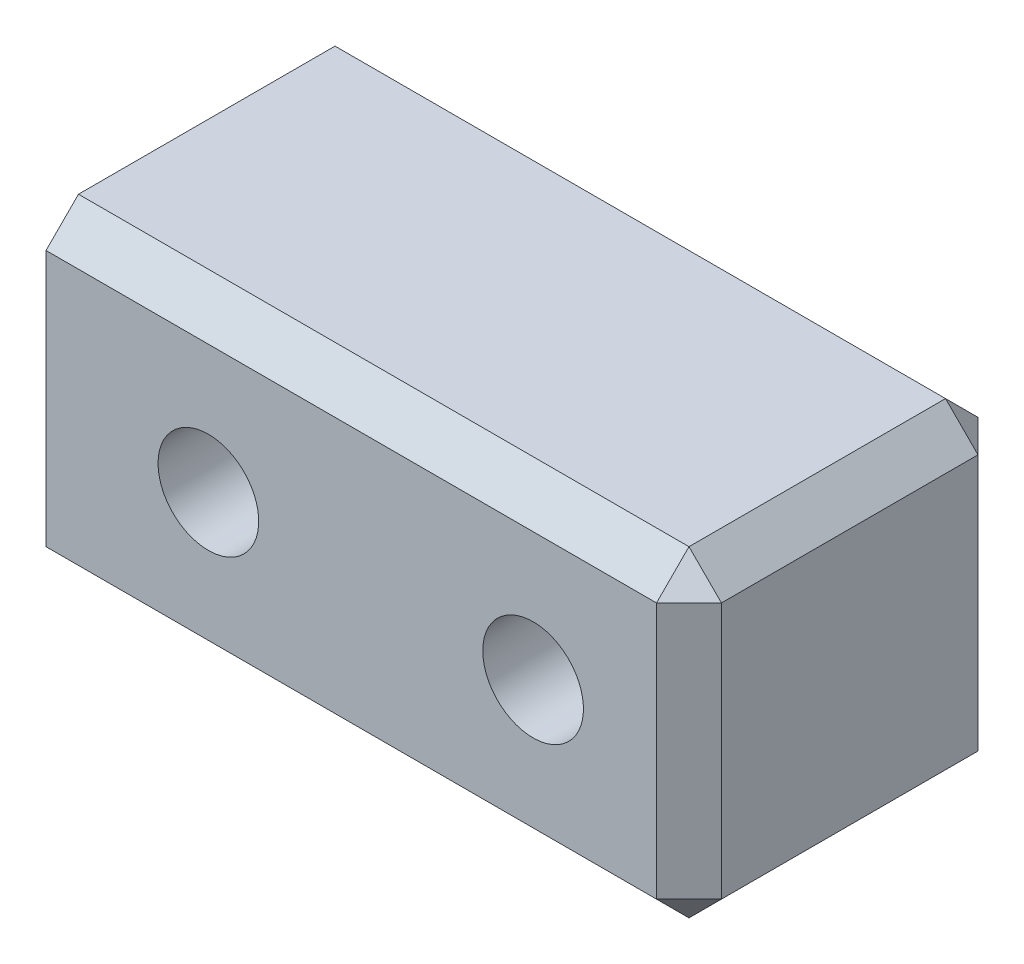
ISO-10303-21;
HEADER;
FILE_DESCRIPTION(('STEP AP214'),'2;1');
FILE_NAME('part.step','',(''),(''),'','','');
FILE_SCHEMA(('AUTOMOTIVE_DESIGN { 1 0 10303 214 1 1 1 1 }'));
ENDSEC;
DATA;
#1=APPLICATION_CONTEXT('core data for automotive mechanical design processes');
#2=APPLICATION_PROTOCOL_DEFINITION('international standard','automotive_design',2000,#1);
#3=PRODUCT_CONTEXT('',#1,'mechanical');
#4=PRODUCT('Part','Part','',(#3));
#5=PRODUCT_RELATED_PRODUCT_CATEGORY('part','',(#4));
#6=PRODUCT_DEFINITION_FORMATION('','',#4);
#7=PRODUCT_DEFINITION_CONTEXT('part definition',#1,'design');
#8=PRODUCT_DEFINITION('design','',#6,#7);
#9=PRODUCT_DEFINITION_SHAPE('','',#8);
#10=(LENGTH_UNIT() NAMED_UNIT(*) SI_UNIT(.MILLI.,.METRE.));
#11=(NAMED_UNIT(*) PLANE_ANGLE_UNIT() SI_UNIT($,.RADIAN.));
#12=(NAMED_UNIT(*) SI_UNIT($,.STERADIAN.) SOLID_ANGLE_UNIT());
#13=UNCERTAINTY_MEASURE_WITH_UNIT(LENGTH_MEASURE(1.E-05),#10,'distance_accuracy_value','');
#14=(GEOMETRIC_REPRESENTATION_CONTEXT(3) GLOBAL_UNCERTAINTY_ASSIGNED_CONTEXT((#13)) GLOBAL_UNIT_ASSIGNED_CONTEXT((#10,
#11,#12)) REPRESENTATION_CONTEXT('',''));
#15=CARTESIAN_POINT('',(0.,0.,0.));
#16=DIRECTION('',(0.,0.,1.));
#17=DIRECTION('',(1.,0.,0.));
#18=AXIS2_PLACEMENT_3D('',#15,#16,#17);
#19=CARTESIAN_POINT('',(0.,0.,-9.9));
#20=DIRECTION('',(0.,0.,1.));
#21=DIRECTION('',(-1.,0.,0.));
#22=AXIS2_PLACEMENT_3D('',#19,#20,#21);
#23=PLANE('',#22);
#24=DIRECTION('',(0.,-1.,0.));
#25=VECTOR('',#24,1.);
#26=CARTESIAN_POINT('',(0.,0.,-9.9));
#27=LINE('',#26,#25);
#28=CARTESIAN_POINT('',(0.,8.9,-9.9));
#29=VERTEX_POINT('',#28);
#30=CARTESIAN_POINT('',(0.,1.,-9.9));
#31=VERTEX_POINT('',#30);
#32=EDGE_CURVE('E230',#29,#31,#27,.T.);
#33=ORIENTED_EDGE('',*,*,#32,.F.);
#34=DIRECTION('',(-1.,0.,0.));
#35=VECTOR('',#34,1.);
#36=CARTESIAN_POINT('',(0.,8.9,-9.9));
#37=LINE('',#36,#35);
#38=CARTESIAN_POINT('',(18.8,8.9,-9.9));
#39=VERTEX_POINT('',#38);
#40=EDGE_CURVE('E170',#39,#29,#37,.T.);
#41=ORIENTED_EDGE('',*,*,#40,.F.);
#42=DIRECTION('',(0.,1.,0.));
#43=VECTOR('',#42,1.);
#44=CARTESIAN_POINT('',(18.8,0.,-9.9));
#45=LINE('',#44,#43);
#46=CARTESIAN_POINT('',(18.8,1.,-9.9));
#47=VERTEX_POINT('',#46);
#48=EDGE_CURVE('E173',#47,#39,#45,.T.);
#49=ORIENTED_EDGE('',*,*,#48,.F.);
#50=DIRECTION('',(1.,0.,0.));
#51=VECTOR('',#50,1.);
#52=CARTESIAN_POINT('',(0.,1.,-9.9));
#53=LINE('',#52,#51);
#54=EDGE_CURVE('E176',#31,#47,#53,.T.);
#55=ORIENTED_EDGE('',*,*,#54,.F.);
#56=EDGE_LOOP('',(#33,#41,#49,#55));
#57=FACE_BOUND('',#56,.T.);
#58=CARTESIAN_POINT('',(5.,4.95,-9.9));
#59=DIRECTION('',(0.,0.,1.));
#60=DIRECTION('',(1.,0.,0.));
#61=AXIS2_PLACEMENT_3D('',#58,#59,#60);
#62=CIRCLE('',#61,1.55);
#63=CARTESIAN_POINT('',(3.45,4.95,-9.9));
#64=VERTEX_POINT('',#63);
#65=EDGE_CURVE('E224',#64,#64,#62,.T.);
#66=ORIENTED_EDGE('',*,*,#65,.T.);
#67=EDGE_LOOP('',(#66));
#68=FACE_BOUND('',#67,.T.);
#69=CARTESIAN_POINT('',(15.,4.95,-9.9));
#70=DIRECTION('',(0.,0.,1.));
#71=DIRECTION('',(1.,0.,0.));
#72=AXIS2_PLACEMENT_3D('',#69,#70,#71);
#73=CIRCLE('',#72,1.55);
#74=CARTESIAN_POINT('',(13.45,4.95,-9.9));
#75=VERTEX_POINT('',#74);
#76=EDGE_CURVE('E216',#75,#75,#73,.T.);
#77=ORIENTED_EDGE('',*,*,#76,.T.);
#78=EDGE_LOOP('',(#77));
#79=FACE_BOUND('',#78,.T.);
#80=ADVANCED_FACE('F43',(#57,#68,#79),#23,.F.);
#81=CARTESIAN_POINT('',(0.,0.,0.));
#82=DIRECTION('',(0.,0.,1.));
#83=DIRECTION('',(-1.,0.,0.));
#84=AXIS2_PLACEMENT_3D('',#81,#82,#83);
#85=PLANE('',#84);
#86=CARTESIAN_POINT('',(5.,4.95,0.));
#87=DIRECTION('',(0.,0.,1.));
#88=DIRECTION('',(1.,0.,0.));
#89=AXIS2_PLACEMENT_3D('',#86,#87,#88);
#90=CIRCLE('',#89,1.55);
#91=CARTESIAN_POINT('',(3.45,4.95,0.));
#92=VERTEX_POINT('',#91);
#93=EDGE_CURVE('E221',#92,#92,#90,.T.);
#94=ORIENTED_EDGE('',*,*,#93,.F.);
#95=EDGE_LOOP('',(#94));
#96=FACE_BOUND('',#95,.T.);
#97=DIRECTION('',(0.,-1.,0.));
#98=VECTOR('',#97,1.);
#99=CARTESIAN_POINT('',(18.8,0.,0.));
#100=LINE('',#99,#98);
#101=CARTESIAN_POINT('',(18.8,8.9,0.));
#102=VERTEX_POINT('',#101);
#103=CARTESIAN_POINT('',(18.8,1.,0.));
#104=VERTEX_POINT('',#103);
#105=EDGE_CURVE('E191',#102,#104,#100,.T.);
#106=ORIENTED_EDGE('',*,*,#105,.F.);
#107=DIRECTION('',(1.,0.,0.));
#108=VECTOR('',#107,1.);
#109=CARTESIAN_POINT('',(19.8,8.9,0.));
#110=LINE('',#109,#108);
#111=CARTESIAN_POINT('',(0.,8.9,0.));
#112=VERTEX_POINT('',#111);
#113=EDGE_CURVE('E189',#112,#102,#110,.T.);
#114=ORIENTED_EDGE('',*,*,#113,.F.);
#115=DIRECTION('',(0.,-1.,0.));
#116=VECTOR('',#115,1.);
#117=CARTESIAN_POINT('',(0.,0.,0.));
#118=LINE('',#117,#116);
#119=CARTESIAN_POINT('',(0.,1.,0.));
#120=VERTEX_POINT('',#119);
#121=EDGE_CURVE('E227',#112,#120,#118,.T.);
#122=ORIENTED_EDGE('',*,*,#121,.T.);
#123=DIRECTION('',(-1.,0.,0.));
#124=VECTOR('',#123,1.);
#125=CARTESIAN_POINT('',(0.,1.,0.));
#126=LINE('',#125,#124);
#127=EDGE_CURVE('E193',#104,#120,#126,.T.);
#128=ORIENTED_EDGE('',*,*,#127,.F.);
#129=EDGE_LOOP('',(#106,#114,#122,#128));
#130=FACE_BOUND('',#129,.T.);
#131=CARTESIAN_POINT('',(15.,4.95,0.));
#132=DIRECTION('',(0.,0.,1.));
#133=DIRECTION('',(1.,0.,0.));
#134=AXIS2_PLACEMENT_3D('',#131,#132,#133);
#135=CIRCLE('',#134,1.55);
#136=CARTESIAN_POINT('',(13.45,4.95,0.));
#137=VERTEX_POINT('',#136);
#138=EDGE_CURVE('E213',#137,#137,#135,.T.);
#139=ORIENTED_EDGE('',*,*,#138,.F.);
#140=EDGE_LOOP('',(#139));
#141=FACE_BOUND('',#140,.T.);
#142=ADVANCED_FACE('F247',(#96,#130,#141),#85,.T.);
#143=CARTESIAN_POINT('',(0.,0.,-9.9));
#144=DIRECTION('',(1.,0.,0.));
#145=DIRECTION('',(0.,0.,1.));
#146=AXIS2_PLACEMENT_3D('',#143,#144,#145);
#147=PLANE('',#146);
#148=DIRECTION('',(0.,0.,1.));
#149=VECTOR('',#148,1.);
#150=CARTESIAN_POINT('',(0.,0.,-9.9));
#151=LINE('',#150,#149);
#152=CARTESIAN_POINT('',(0.,0.,-8.9));
#153=VERTEX_POINT('',#152);
#154=CARTESIAN_POINT('',(0.,0.,-1.));
#155=VERTEX_POINT('',#154);
#156=EDGE_CURVE('E152',#153,#155,#151,.T.);
#157=ORIENTED_EDGE('',*,*,#156,.T.);
#158=DIRECTION('',(0.,-0.707106781186549,-0.707106781186546));
#159=VECTOR('',#158,1.);
#160=CARTESIAN_POINT('',(0.,0.,-1.));
#161=LINE('',#160,#159);
#162=EDGE_CURVE('E184',#120,#155,#161,.T.);
#163=ORIENTED_EDGE('',*,*,#162,.F.);
#164=ORIENTED_EDGE('',*,*,#121,.F.);
#165=DIRECTION('',(0.,-0.707106781186546,0.707106781186549));
#166=VECTOR('',#165,1.);
#167=CARTESIAN_POINT('',(0.,9.9,-1.));
#168=LINE('',#167,#166);
#169=CARTESIAN_POINT('',(0.,9.9,-1.00000000000001));
#170=VERTEX_POINT('',#169);
#171=EDGE_CURVE('E182',#170,#112,#168,.T.);
#172=ORIENTED_EDGE('',*,*,#171,.F.);
#173=DIRECTION('',(0.,0.,1.));
#174=VECTOR('',#173,1.);
#175=CARTESIAN_POINT('',(0.,9.9,-9.9));
#176=LINE('',#175,#174);
#177=CARTESIAN_POINT('',(0.,9.9,-8.9));
#178=VERTEX_POINT('',#177);
#179=EDGE_CURVE('E155',#178,#170,#176,.T.);
#180=ORIENTED_EDGE('',*,*,#179,.F.);
#181=DIRECTION('',(0.,-0.707106781186546,-0.707106781186549));
#182=VECTOR('',#181,1.);
#183=CARTESIAN_POINT('',(0.,8.9,-9.9));
#184=LINE('',#183,#182);
#185=EDGE_CURVE('E179',#29,#178,#184,.F.);
#186=ORIENTED_EDGE('',*,*,#185,.F.);
#187=ORIENTED_EDGE('',*,*,#32,.T.);
#188=DIRECTION('',(0.,-0.707106781186546,0.707106781186549));
#189=VECTOR('',#188,1.);
#190=CARTESIAN_POINT('',(0.,1.,-9.9));
#191=LINE('',#190,#189);
#192=EDGE_CURVE('E187',#153,#31,#191,.F.);
#193=ORIENTED_EDGE('',*,*,#192,.F.);
#194=EDGE_LOOP('',(#157,#163,#164,#172,#180,#186,#187,#193));
#195=FACE_BOUND('',#194,.T.);
#196=ADVANCED_FACE('F241',(#195),#147,.F.);
#197=CARTESIAN_POINT('',(0.,0.,-9.9));
#198=DIRECTION('',(0.,1.,0.));
#199=DIRECTION('',(0.,0.,-1.));
#200=AXIS2_PLACEMENT_3D('',#197,#198,#199);
#201=PLANE('',#200);
#202=DIRECTION('',(0.,0.,-1.));
#203=VECTOR('',#202,1.);
#204=CARTESIAN_POINT('',(18.8,0.,-9.9));
#205=LINE('',#204,#203);
#206=CARTESIAN_POINT('',(18.8,0.,-1.));
#207=VERTEX_POINT('',#206);
#208=CARTESIAN_POINT('',(18.8,0.,-8.9));
#209=VERTEX_POINT('',#208);
#210=EDGE_CURVE('E165',#207,#209,#205,.T.);
#211=ORIENTED_EDGE('',*,*,#210,.F.);
#212=DIRECTION('',(1.,0.,0.));
#213=VECTOR('',#212,1.);
#214=CARTESIAN_POINT('',(19.8,0.,-1.));
#215=LINE('',#214,#213);
#216=EDGE_CURVE('E162',#155,#207,#215,.T.);
#217=ORIENTED_EDGE('',*,*,#216,.F.);
#218=ORIENTED_EDGE('',*,*,#156,.F.);
#219=DIRECTION('',(-1.,0.,0.));
#220=VECTOR('',#219,1.);
#221=CARTESIAN_POINT('',(0.,0.,-8.9));
#222=LINE('',#221,#220);
#223=EDGE_CURVE('E168',#209,#153,#222,.T.);
#224=ORIENTED_EDGE('',*,*,#223,.F.);
#225=EDGE_LOOP('',(#211,#217,#218,#224));
#226=FACE_BOUND('',#225,.T.);
#227=ADVANCED_FACE('F275',(#226),#201,.F.);
#228=CARTESIAN_POINT('',(19.8,0.,-9.9));
#229=DIRECTION('',(-1.,0.,0.));
#230=DIRECTION('',(0.,0.,-1.));
#231=AXIS2_PLACEMENT_3D('',#228,#229,#230);
#232=PLANE('',#231);
#233=DIRECTION('',(0.,-1.,0.));
#234=VECTOR('',#233,1.);
#235=CARTESIAN_POINT('',(19.8,0.,-8.9));
#236=LINE('',#235,#234);
#237=CARTESIAN_POINT('',(19.8,8.9,-8.9));
#238=VERTEX_POINT('',#237);
#239=CARTESIAN_POINT('',(19.8,1.,-8.9));
#240=VERTEX_POINT('',#239);
#241=EDGE_CURVE('E148',#238,#240,#236,.T.);
#242=ORIENTED_EDGE('',*,*,#241,.F.);
#243=DIRECTION('',(0.,0.,-1.));
#244=VECTOR('',#243,1.);
#245=CARTESIAN_POINT('',(19.8,8.9,-9.9));
#246=LINE('',#245,#244);
#247=CARTESIAN_POINT('',(19.8,8.9,-1.));
#248=VERTEX_POINT('',#247);
#249=EDGE_CURVE('E135',#248,#238,#246,.T.);
#250=ORIENTED_EDGE('',*,*,#249,.F.);
#251=DIRECTION('',(0.,1.,0.));
#252=VECTOR('',#251,1.);
#253=CARTESIAN_POINT('',(19.8,9.9,-1.));
#254=LINE('',#253,#252);
#255=CARTESIAN_POINT('',(19.8,1.,-1.));
#256=VERTEX_POINT('',#255);
#257=EDGE_CURVE('E141',#256,#248,#254,.T.);
#258=ORIENTED_EDGE('',*,*,#257,.F.);
#259=DIRECTION('',(0.,0.,1.));
#260=VECTOR('',#259,1.);
#261=CARTESIAN_POINT('',(19.8,1.,-9.9));
#262=LINE('',#261,#260);
#263=EDGE_CURVE('E160',#240,#256,#262,.T.);
#264=ORIENTED_EDGE('',*,*,#263,.F.);
#265=EDGE_LOOP('',(#242,#250,#258,#264));
#266=FACE_BOUND('',#265,.T.);
#267=ADVANCED_FACE('F150',(#266),#232,.F.);
#268=CARTESIAN_POINT('',(0.,9.9,-9.9));
#269=DIRECTION('',(0.,-1.,0.));
#270=DIRECTION('',(0.,0.,1.));
#271=AXIS2_PLACEMENT_3D('',#268,#269,#270);
#272=PLANE('',#271);
#273=DIRECTION('',(0.,0.,1.));
#274=VECTOR('',#273,1.);
#275=CARTESIAN_POINT('',(18.8,9.9,-9.9));
#276=LINE('',#275,#274);
#277=CARTESIAN_POINT('',(18.8,9.9,-8.9));
#278=VERTEX_POINT('',#277);
#279=CARTESIAN_POINT('',(18.8,9.9,-1.));
#280=VERTEX_POINT('',#279);
#281=EDGE_CURVE('E52',#278,#280,#276,.T.);
#282=ORIENTED_EDGE('',*,*,#281,.F.);
#283=DIRECTION('',(1.,0.,0.));
#284=VECTOR('',#283,1.);
#285=CARTESIAN_POINT('',(0.,9.9,-8.9));
#286=LINE('',#285,#284);
#287=EDGE_CURVE('E196',#178,#278,#286,.T.);
#288=ORIENTED_EDGE('',*,*,#287,.F.);
#289=ORIENTED_EDGE('',*,*,#179,.T.);
#290=DIRECTION('',(-1.,0.,0.));
#291=VECTOR('',#290,1.);
#292=CARTESIAN_POINT('',(0.,9.9,-1.));
#293=LINE('',#292,#291);
#294=EDGE_CURVE('E11',#280,#170,#293,.T.);
#295=ORIENTED_EDGE('',*,*,#294,.F.);
#296=EDGE_LOOP('',(#282,#288,#289,#295));
#297=FACE_BOUND('',#296,.T.);
#298=ADVANCED_FACE('F238',(#297),#272,.F.);
#299=CARTESIAN_POINT('',(5.,4.95,-9.9));
#300=DIRECTION('',(0.,0.,1.));
#301=DIRECTION('',(-1.,0.,0.));
#302=AXIS2_PLACEMENT_3D('',#299,#300,#301);
#303=CYLINDRICAL_SURFACE('',#302,1.55);
#304=CARTESIAN_POINT('',(3.45,4.95,-9.9));
#305=CARTESIAN_POINT('',(3.45,4.95,-9.796875));
#306=CARTESIAN_POINT('',(3.45,4.95,-9.69375));
#307=CARTESIAN_POINT('',(3.45,4.95,-9.4875));
#308=CARTESIAN_POINT('',(3.45,4.95,-9.384375));
#309=CARTESIAN_POINT('',(3.45,4.95,-9.178125));
#310=CARTESIAN_POINT('',(3.45,4.95,-9.075));
#311=CARTESIAN_POINT('',(3.45,4.95,-8.86875));
#312=CARTESIAN_POINT('',(3.45,4.95,-8.765625));
#313=CARTESIAN_POINT('',(3.45,4.95,-8.559375));
#314=CARTESIAN_POINT('',(3.45,4.95,-8.45625));
#315=CARTESIAN_POINT('',(3.45,4.95,-8.25));
#316=CARTESIAN_POINT('',(3.45,4.95,-8.146875));
#317=CARTESIAN_POINT('',(3.45,4.95,-7.940625));
#318=CARTESIAN_POINT('',(3.45,4.95,-7.8375));
#319=CARTESIAN_POINT('',(3.45,4.95,-7.63125));
#320=CARTESIAN_POINT('',(3.45,4.95,-7.528125));
#321=CARTESIAN_POINT('',(3.45,4.95,-7.321875));
#322=CARTESIAN_POINT('',(3.45,4.95,-7.21875));
#323=CARTESIAN_POINT('',(3.45,4.95,-7.0125));
#324=CARTESIAN_POINT('',(3.45,4.95,-6.909375));
#325=CARTESIAN_POINT('',(3.45,4.95,-6.703125));
#326=CARTESIAN_POINT('',(3.45,4.95,-6.6));
#327=CARTESIAN_POINT('',(3.45,4.95,-6.39375));
#328=CARTESIAN_POINT('',(3.45,4.95,-6.290625));
#329=CARTESIAN_POINT('',(3.45,4.95,-6.084375));
#330=CARTESIAN_POINT('',(3.45,4.95,-5.98125));
#331=CARTESIAN_POINT('',(3.45,4.95,-5.775));
#332=CARTESIAN_POINT('',(3.45,4.95,-5.671875));
#333=CARTESIAN_POINT('',(3.45,4.95,-5.465625));
#334=CARTESIAN_POINT('',(3.45,4.95,-5.3625));
#335=CARTESIAN_POINT('',(3.45,4.95,-5.15625));
#336=CARTESIAN_POINT('',(3.45,4.95,-5.053125));
#337=CARTESIAN_POINT('',(3.45,4.95,-4.846875));
#338=CARTESIAN_POINT('',(3.45,4.95,-4.74375));
#339=CARTESIAN_POINT('',(3.45,4.95,-4.5375));
#340=CARTESIAN_POINT('',(3.45,4.95,-4.434375));
#341=CARTESIAN_POINT('',(3.45,4.95,-4.228125));
#342=CARTESIAN_POINT('',(3.45,4.95,-4.125));
#343=CARTESIAN_POINT('',(3.45,4.95,-3.91875));
#344=CARTESIAN_POINT('',(3.45,4.95,-3.815625));
#345=CARTESIAN_POINT('',(3.45,4.95,-3.609375));
#346=CARTESIAN_POINT('',(3.45,4.95,-3.50625));
#347=CARTESIAN_POINT('',(3.45,4.95,-3.3));
#348=CARTESIAN_POINT('',(3.45,4.95,-3.196875));
#349=CARTESIAN_POINT('',(3.45,4.95,-2.990625));
#350=CARTESIAN_POINT('',(3.45,4.95,-2.8875));
#351=CARTESIAN_POINT('',(3.45,4.95,-2.68125));
#352=CARTESIAN_POINT('',(3.45,4.95,-2.578125));
#353=CARTESIAN_POINT('',(3.45,4.95,-2.371875));
#354=CARTESIAN_POINT('',(3.45,4.95,-2.26875));
#355=CARTESIAN_POINT('',(3.45,4.95,-2.0625));
#356=CARTESIAN_POINT('',(3.45,4.95,-1.959375));
#357=CARTESIAN_POINT('',(3.45,4.95,-1.753125));
#358=CARTESIAN_POINT('',(3.45,4.95,-1.65));
#359=CARTESIAN_POINT('',(3.45,4.95,-1.44375));
#360=CARTESIAN_POINT('',(3.45,4.95,-1.340625));
#361=CARTESIAN_POINT('',(3.45,4.95,-1.134375));
#362=CARTESIAN_POINT('',(3.45,4.95,-1.03125));
#363=CARTESIAN_POINT('',(3.45,4.95,-0.825));
#364=CARTESIAN_POINT('',(3.45,4.95,-0.721875));
#365=CARTESIAN_POINT('',(3.45,4.95,-0.515625));
#366=CARTESIAN_POINT('',(3.45,4.95,-0.4125));
#367=CARTESIAN_POINT('',(3.45,4.95,-0.20625));
#368=CARTESIAN_POINT('',(3.45,4.95,-0.103125));
#369=CARTESIAN_POINT('',(3.45,4.95,0.));
#370=B_SPLINE_CURVE_WITH_KNOTS('',3,(#304,#305,#306,#307,#308,#309,#310,#311,#312,#313,#314,
#315,#316,#317,#318,#319,#320,#321,#322,#323,#324,#325,#326,#327,#328,#329,#330,#331,#332,#333,
#334,#335,#336,#337,#338,#339,#340,#341,#342,#343,#344,#345,#346,#347,#348,#349,#350,#351,#352,
#353,#354,#355,#356,#357,#358,#359,#360,#361,#362,#363,#364,#365,#366,#367,#368,#369),
.UNSPECIFIED.,.F.,.F.,(4,2,2,2,2,2,2,2,2,2,2,2,2,2,2,2,2,2,2,2,2,2,2,2,2,2,2,2,2,2,2,2,4),(0.,
0.309375000000001,0.618750000000001,0.928125000000002,1.2375,1.546875,1.85625,2.165625,2.475,
2.784375,3.09375,3.403125,3.7125,4.021875,4.33125,4.640625,4.95,5.259375,5.56875,5.878125,
6.1875,6.496875,6.80625,7.115625,7.425,7.734375,8.04375,8.353125,8.6625,8.971875,9.28125,
9.590625,9.9),.UNSPECIFIED.);
#371=EDGE_CURVE('BSEAM292',#64,#92,#370,.T.);
#372=ORIENTED_EDGE('',*,*,#65,.F.);
#373=ORIENTED_EDGE('',*,*,#93,.T.);
#374=ORIENTED_EDGE('',*,*,#371,.T.);
#375=ORIENTED_EDGE('',*,*,#371,.F.);
#376=EDGE_LOOP('',(#372,#374,#373,#375));
#377=FACE_BOUND('',#376,.T.);
#378=ADVANCED_FACE('F292',(#377),#303,.F.);
#379=CARTESIAN_POINT('',(15.,4.95,-9.9));
#380=DIRECTION('',(0.,0.,1.));
#381=DIRECTION('',(-1.,0.,0.));
#382=AXIS2_PLACEMENT_3D('',#379,#380,#381);
#383=CYLINDRICAL_SURFACE('',#382,1.55);
#384=CARTESIAN_POINT('',(13.45,4.95,-9.9));
#385=CARTESIAN_POINT('',(13.45,4.95,-9.796875));
#386=CARTESIAN_POINT('',(13.45,4.95,-9.69375));
#387=CARTESIAN_POINT('',(13.45,4.95,-9.4875));
#388=CARTESIAN_POINT('',(13.45,4.95,-9.384375));
#389=CARTESIAN_POINT('',(13.45,4.95,-9.178125));
#390=CARTESIAN_POINT('',(13.45,4.95,-9.075));
#391=CARTESIAN_POINT('',(13.45,4.95,-8.86875));
#392=CARTESIAN_POINT('',(13.45,4.95,-8.765625));
#393=CARTESIAN_POINT('',(13.45,4.95,-8.559375));
#394=CARTESIAN_POINT('',(13.45,4.95,-8.45625));
#395=CARTESIAN_POINT('',(13.45,4.95,-8.25));
#396=CARTESIAN_POINT('',(13.45,4.95,-8.146875));
#397=CARTESIAN_POINT('',(13.45,4.95,-7.940625));
#398=CARTESIAN_POINT('',(13.45,4.95,-7.8375));
#399=CARTESIAN_POINT('',(13.45,4.95,-7.63125));
#400=CARTESIAN_POINT('',(13.45,4.95,-7.528125));
#401=CARTESIAN_POINT('',(13.45,4.95,-7.321875));
#402=CARTESIAN_POINT('',(13.45,4.95,-7.21875));
#403=CARTESIAN_POINT('',(13.45,4.95,-7.0125));
#404=CARTESIAN_POINT('',(13.45,4.95,-6.909375));
#405=CARTESIAN_POINT('',(13.45,4.95,-6.703125));
#406=CARTESIAN_POINT('',(13.45,4.95,-6.6));
#407=CARTESIAN_POINT('',(13.45,4.95,-6.39375));
#408=CARTESIAN_POINT('',(13.45,4.95,-6.290625));
#409=CARTESIAN_POINT('',(13.45,4.95,-6.084375));
#410=CARTESIAN_POINT('',(13.45,4.95,-5.98125));
#411=CARTESIAN_POINT('',(13.45,4.95,-5.775));
#412=CARTESIAN_POINT('',(13.45,4.95,-5.671875));
#413=CARTESIAN_POINT('',(13.45,4.95,-5.465625));
#414=CARTESIAN_POINT('',(13.45,4.95,-5.3625));
#415=CARTESIAN_POINT('',(13.45,4.95,-5.15625));
#416=CARTESIAN_POINT('',(13.45,4.95,-5.053125));
#417=CARTESIAN_POINT('',(13.45,4.95,-4.846875));
#418=CARTESIAN_POINT('',(13.45,4.95,-4.74375));
#419=CARTESIAN_POINT('',(13.45,4.95,-4.5375));
#420=CARTESIAN_POINT('',(13.45,4.95,-4.434375));
#421=CARTESIAN_POINT('',(13.45,4.95,-4.228125));
#422=CARTESIAN_POINT('',(13.45,4.95,-4.125));
#423=CARTESIAN_POINT('',(13.45,4.95,-3.91875));
#424=CARTESIAN_POINT('',(13.45,4.95,-3.815625));
#425=CARTESIAN_POINT('',(13.45,4.95,-3.609375));
#426=CARTESIAN_POINT('',(13.45,4.95,-3.50625));
#427=CARTESIAN_POINT('',(13.45,4.95,-3.3));
#428=CARTESIAN_POINT('',(13.45,4.95,-3.196875));
#429=CARTESIAN_POINT('',(13.45,4.95,-2.990625));
#430=CARTESIAN_POINT('',(13.45,4.95,-2.8875));
#431=CARTESIAN_POINT('',(13.45,4.95,-2.68125));
#432=CARTESIAN_POINT('',(13.45,4.95,-2.578125));
#433=CARTESIAN_POINT('',(13.45,4.95,-2.371875));
#434=CARTESIAN_POINT('',(13.45,4.95,-2.26875));
#435=CARTESIAN_POINT('',(13.45,4.95,-2.0625));
#436=CARTESIAN_POINT('',(13.45,4.95,-1.959375));
#437=CARTESIAN_POINT('',(13.45,4.95,-1.753125));
#438=CARTESIAN_POINT('',(13.45,4.95,-1.65));
#439=CARTESIAN_POINT('',(13.45,4.95,-1.44375));
#440=CARTESIAN_POINT('',(13.45,4.95,-1.340625));
#441=CARTESIAN_POINT('',(13.45,4.95,-1.134375));
#442=CARTESIAN_POINT('',(13.45,4.95,-1.03125));
#443=CARTESIAN_POINT('',(13.45,4.95,-0.825));
#444=CARTESIAN_POINT('',(13.45,4.95,-0.721875));
#445=CARTESIAN_POINT('',(13.45,4.95,-0.515625));
#446=CARTESIAN_POINT('',(13.45,4.95,-0.4125));
#447=CARTESIAN_POINT('',(13.45,4.95,-0.20625));
#448=CARTESIAN_POINT('',(13.45,4.95,-0.103125));
#449=CARTESIAN_POINT('',(13.45,4.95,0.));
#450=B_SPLINE_CURVE_WITH_KNOTS('',3,(#384,#385,#386,#387,#388,#389,#390,#391,#392,#393,#394,
#395,#396,#397,#398,#399,#400,#401,#402,#403,#404,#405,#406,#407,#408,#409,#410,#411,#412,#413,
#414,#415,#416,#417,#418,#419,#420,#421,#422,#423,#424,#425,#426,#427,#428,#429,#430,#431,#432,
#433,#434,#435,#436,#437,#438,#439,#440,#441,#442,#443,#444,#445,#446,#447,#448,#449),
.UNSPECIFIED.,.F.,.F.,(4,2,2,2,2,2,2,2,2,2,2,2,2,2,2,2,2,2,2,2,2,2,2,2,2,2,2,2,2,2,2,2,4),(0.,
0.309375000000001,0.618750000000001,0.928125000000002,1.2375,1.546875,1.85625,2.165625,2.475,
2.784375,3.09375,3.403125,3.7125,4.021875,4.33125,4.640625,4.95,5.259375,5.56875,5.878125,
6.1875,6.496875,6.80625,7.115625,7.425,7.734375,8.04375,8.353125,8.6625,8.971875,9.28125,
9.590625,9.9),.UNSPECIFIED.);
#451=EDGE_CURVE('BSEAM299',#75,#137,#450,.T.);
#452=ORIENTED_EDGE('',*,*,#76,.F.);
#453=ORIENTED_EDGE('',*,*,#138,.T.);
#454=ORIENTED_EDGE('',*,*,#451,.T.);
#455=ORIENTED_EDGE('',*,*,#451,.F.);
#456=EDGE_LOOP('',(#452,#454,#453,#455));
#457=FACE_BOUND('',#456,.T.);
#458=ADVANCED_FACE('F299',(#457),#383,.F.);
#459=CARTESIAN_POINT('',(0.,8.9,-9.9));
#460=DIRECTION('',(0.,-0.707106781186549,0.707106781186546));
#461=DIRECTION('',(-1.,0.,0.));
#462=AXIS2_PLACEMENT_3D('',#459,#460,#461);
#463=PLANE('',#462);
#464=ORIENTED_EDGE('',*,*,#185,.T.);
#465=ORIENTED_EDGE('',*,*,#287,.T.);
#466=DIRECTION('',(0.,0.707106781186546,0.707106781186549));
#467=VECTOR('',#466,1.);
#468=CARTESIAN_POINT('',(18.8,8.9,-9.9));
#469=LINE('',#468,#467);
#470=EDGE_CURVE('E47',#278,#39,#469,.F.);
#471=ORIENTED_EDGE('',*,*,#470,.T.);
#472=ORIENTED_EDGE('',*,*,#40,.T.);
#473=EDGE_LOOP('',(#464,#465,#471,#472));
#474=FACE_BOUND('',#473,.T.);
#475=ADVANCED_FACE('F45',(#474),#463,.F.);
#476=CARTESIAN_POINT('',(18.8,9.9,-9.9));
#477=DIRECTION('',(-0.707106781186546,-0.707106781186549,0.));
#478=DIRECTION('',(0.,0.,1.));
#479=AXIS2_PLACEMENT_3D('',#476,#477,#478);
#480=PLANE('',#479);
#481=DIRECTION('',(-0.707106781186549,0.707106781186546,0.));
#482=VECTOR('',#481,1.);
#483=CARTESIAN_POINT('',(19.8,8.9,-1.));
#484=LINE('',#483,#482);
#485=EDGE_CURVE('E125',#280,#248,#484,.F.);
#486=ORIENTED_EDGE('',*,*,#485,.T.);
#487=ORIENTED_EDGE('',*,*,#249,.T.);
#488=DIRECTION('',(0.707106781186549,-0.707106781186546,0.));
#489=VECTOR('',#488,1.);
#490=CARTESIAN_POINT('',(19.3,9.4,-8.9));
#491=LINE('',#490,#489);
#492=EDGE_CURVE('E67',#238,#278,#491,.F.);
#493=ORIENTED_EDGE('',*,*,#492,.T.);
#494=ORIENTED_EDGE('',*,*,#281,.T.);
#495=EDGE_LOOP('',(#486,#487,#493,#494));
#496=FACE_BOUND('',#495,.T.);
#497=ADVANCED_FACE('F133',(#496),#480,.F.);
#498=CARTESIAN_POINT('',(0.,9.9,-1.));
#499=DIRECTION('',(0.,0.707106781186549,0.707106781186546));
#500=DIRECTION('',(1.,0.,0.));
#501=AXIS2_PLACEMENT_3D('',#498,#499,#500);
#502=PLANE('',#501);
#503=ORIENTED_EDGE('',*,*,#171,.T.);
#504=ORIENTED_EDGE('',*,*,#113,.T.);
#505=DIRECTION('',(0.,0.707106781186546,-0.707106781186549));
#506=VECTOR('',#505,1.);
#507=CARTESIAN_POINT('',(18.8,9.4,-0.500000000000002));
#508=LINE('',#507,#506);
#509=EDGE_CURVE('E59',#102,#280,#508,.T.);
#510=ORIENTED_EDGE('',*,*,#509,.T.);
#511=ORIENTED_EDGE('',*,*,#294,.T.);
#512=EDGE_LOOP('',(#503,#504,#510,#511));
#513=FACE_BOUND('',#512,.T.);
#514=ADVANCED_FACE('F243',(#513),#502,.T.);
#515=CARTESIAN_POINT('',(18.8,8.9,-9.9));
#516=DIRECTION('',(0.577350269189626,0.577350269189628,-0.577350269189624));
#517=DIRECTION('',(-0.707106781186549,0.707106781186546,0.));
#518=AXIS2_PLACEMENT_3D('',#515,#516,#517);
#519=PLANE('',#518);
#520=ORIENTED_EDGE('',*,*,#492,.F.);
#521=DIRECTION('',(-0.707106781186546,0.,-0.707106781186549));
#522=VECTOR('',#521,1.);
#523=CARTESIAN_POINT('',(18.8,8.9,-9.9));
#524=LINE('',#523,#522);
#525=EDGE_CURVE('E130',#238,#39,#524,.T.);
#526=ORIENTED_EDGE('',*,*,#525,.T.);
#527=ORIENTED_EDGE('',*,*,#470,.F.);
#528=EDGE_LOOP('',(#520,#526,#527));
#529=FACE_BOUND('',#528,.T.);
#530=ADVANCED_FACE('F264',(#529),#519,.T.);
#531=CARTESIAN_POINT('',(19.8,8.9,-1.));
#532=DIRECTION('',(0.577350269189624,0.577350269189628,0.577350269189626));
#533=DIRECTION('',(0.,0.707106781186546,-0.707106781186549));
#534=AXIS2_PLACEMENT_3D('',#531,#532,#533);
#535=PLANE('',#534);
#536=ORIENTED_EDGE('',*,*,#509,.F.);
#537=DIRECTION('',(-0.707106781186549,0.,0.707106781186546));
#538=VECTOR('',#537,1.);
#539=CARTESIAN_POINT('',(19.8,8.9,-1.));
#540=LINE('',#539,#538);
#541=EDGE_CURVE('E122',#102,#248,#540,.F.);
#542=ORIENTED_EDGE('',*,*,#541,.T.);
#543=ORIENTED_EDGE('',*,*,#485,.F.);
#544=EDGE_LOOP('',(#536,#542,#543));
#545=FACE_BOUND('',#544,.T.);
#546=ADVANCED_FACE('F124',(#545),#535,.T.);
#547=CARTESIAN_POINT('',(0.,1.,-9.9));
#548=DIRECTION('',(0.,0.707106781186549,0.707106781186546));
#549=DIRECTION('',(1.,0.,0.));
#550=AXIS2_PLACEMENT_3D('',#547,#548,#549);
#551=PLANE('',#550);
#552=ORIENTED_EDGE('',*,*,#192,.T.);
#553=ORIENTED_EDGE('',*,*,#54,.T.);
#554=DIRECTION('',(0.,0.707106781186546,-0.707106781186549));
#555=VECTOR('',#554,1.);
#556=CARTESIAN_POINT('',(18.8,0.,-8.9));
#557=LINE('',#556,#555);
#558=EDGE_CURVE('E131',#47,#209,#557,.F.);
#559=ORIENTED_EDGE('',*,*,#558,.T.);
#560=ORIENTED_EDGE('',*,*,#223,.T.);
#561=EDGE_LOOP('',(#552,#553,#559,#560));
#562=FACE_BOUND('',#561,.T.);
#563=ADVANCED_FACE('F272',(#562),#551,.F.);
#564=CARTESIAN_POINT('',(18.8,0.,-9.9));
#565=DIRECTION('',(-0.707106781186549,0.,0.707106781186546));
#566=DIRECTION('',(0.,1.,0.));
#567=AXIS2_PLACEMENT_3D('',#564,#565,#566);
#568=PLANE('',#567);
#569=ORIENTED_EDGE('',*,*,#525,.F.);
#570=ORIENTED_EDGE('',*,*,#241,.T.);
#571=DIRECTION('',(0.707106781186546,0.,0.707106781186549));
#572=VECTOR('',#571,1.);
#573=CARTESIAN_POINT('',(19.3,1.,-9.4));
#574=LINE('',#573,#572);
#575=EDGE_CURVE('E207',#240,#47,#574,.F.);
#576=ORIENTED_EDGE('',*,*,#575,.T.);
#577=ORIENTED_EDGE('',*,*,#48,.T.);
#578=EDGE_LOOP('',(#569,#570,#576,#577));
#579=FACE_BOUND('',#578,.T.);
#580=ADVANCED_FACE('F259',(#579),#568,.F.);
#581=CARTESIAN_POINT('',(19.8,0.,-1.));
#582=DIRECTION('',(0.707106781186546,0.,0.707106781186549));
#583=DIRECTION('',(0.,-1.,0.));
#584=AXIS2_PLACEMENT_3D('',#581,#582,#583);
#585=PLANE('',#584);
#586=ORIENTED_EDGE('',*,*,#541,.F.);
#587=ORIENTED_EDGE('',*,*,#105,.T.);
#588=DIRECTION('',(0.707106781186549,0.,-0.707106781186546));
#589=VECTOR('',#588,1.);
#590=CARTESIAN_POINT('',(19.8,1.,-1.));
#591=LINE('',#590,#589);
#592=EDGE_CURVE('E144',#104,#256,#591,.T.);
#593=ORIENTED_EDGE('',*,*,#592,.T.);
#594=ORIENTED_EDGE('',*,*,#257,.T.);
#595=EDGE_LOOP('',(#586,#587,#593,#594));
#596=FACE_BOUND('',#595,.T.);
#597=ADVANCED_FACE('F142',(#596),#585,.T.);
#598=CARTESIAN_POINT('',(0.,0.,-1.));
#599=DIRECTION('',(0.,-0.707106781186546,0.707106781186549));
#600=DIRECTION('',(-1.,0.,0.));
#601=AXIS2_PLACEMENT_3D('',#598,#599,#600);
#602=PLANE('',#601);
#603=ORIENTED_EDGE('',*,*,#162,.T.);
#604=ORIENTED_EDGE('',*,*,#216,.T.);
#605=DIRECTION('',(0.,0.707106781186549,0.707106781186546));
#606=VECTOR('',#605,1.);
#607=CARTESIAN_POINT('',(18.8,0.500000000000002,-0.5));
#608=LINE('',#607,#606);
#609=EDGE_CURVE('E204',#207,#104,#608,.T.);
#610=ORIENTED_EDGE('',*,*,#609,.T.);
#611=ORIENTED_EDGE('',*,*,#127,.T.);
#612=EDGE_LOOP('',(#603,#604,#610,#611));
#613=FACE_BOUND('',#612,.T.);
#614=ADVANCED_FACE('F250',(#613),#602,.T.);
#615=CARTESIAN_POINT('',(18.8,0.,-8.9));
#616=DIRECTION('',(0.577350269189626,-0.577350269189628,-0.577350269189624));
#617=DIRECTION('',(0.707106781186549,0.707106781186546,0.));
#618=AXIS2_PLACEMENT_3D('',#615,#616,#617);
#619=PLANE('',#618);
#620=ORIENTED_EDGE('',*,*,#575,.F.);
#621=DIRECTION('',(-0.707106781186549,-0.707106781186546,0.));
#622=VECTOR('',#621,1.);
#623=CARTESIAN_POINT('',(18.8,0.,-8.9));
#624=LINE('',#623,#622);
#625=EDGE_CURVE('E202',#240,#209,#624,.T.);
#626=ORIENTED_EDGE('',*,*,#625,.T.);
#627=ORIENTED_EDGE('',*,*,#558,.F.);
#628=EDGE_LOOP('',(#620,#626,#627));
#629=FACE_BOUND('',#628,.T.);
#630=ADVANCED_FACE('F333',(#629),#619,.T.);
#631=CARTESIAN_POINT('',(19.8,1.,-1.));
#632=DIRECTION('',(0.577350269189624,-0.577350269189626,0.577350269189628));
#633=DIRECTION('',(0.,0.707106781186549,0.707106781186546));
#634=AXIS2_PLACEMENT_3D('',#631,#632,#633);
#635=PLANE('',#634);
#636=ORIENTED_EDGE('',*,*,#609,.F.);
#637=DIRECTION('',(0.707106781186549,0.707106781186546,0.));
#638=VECTOR('',#637,1.);
#639=CARTESIAN_POINT('',(19.8,1.,-1.));
#640=LINE('',#639,#638);
#641=EDGE_CURVE('E200',#207,#256,#640,.T.);
#642=ORIENTED_EDGE('',*,*,#641,.T.);
#643=ORIENTED_EDGE('',*,*,#592,.F.);
#644=EDGE_LOOP('',(#636,#642,#643));
#645=FACE_BOUND('',#644,.T.);
#646=ADVANCED_FACE('F254',(#645),#635,.T.);
#647=CARTESIAN_POINT('',(19.8,1.,-9.9));
#648=DIRECTION('',(-0.707106781186546,0.707106781186549,0.));
#649=DIRECTION('',(0.,0.,1.));
#650=AXIS2_PLACEMENT_3D('',#647,#648,#649);
#651=PLANE('',#650);
#652=ORIENTED_EDGE('',*,*,#625,.F.);
#653=ORIENTED_EDGE('',*,*,#263,.T.);
#654=ORIENTED_EDGE('',*,*,#641,.F.);
#655=ORIENTED_EDGE('',*,*,#210,.T.);
#656=EDGE_LOOP('',(#652,#653,#654,#655));
#657=FACE_BOUND('',#656,.T.);
#658=ADVANCED_FACE('F256',(#657),#651,.F.);
#659=CLOSED_SHELL('',(#80,#142,#196,#227,#267,#298,#378,#458,#475,#497,#514,#530,#546,#563,#580,
#597,#614,#630,#646,#658));
#660=MANIFOLD_SOLID_BREP('B2',#659);
#661=ADVANCED_BREP_SHAPE_REPRESENTATION('',(#18,#660),#14);
#662=SHAPE_DEFINITION_REPRESENTATION(#9,#661);
ENDSEC;
END-ISO-10303-21;
